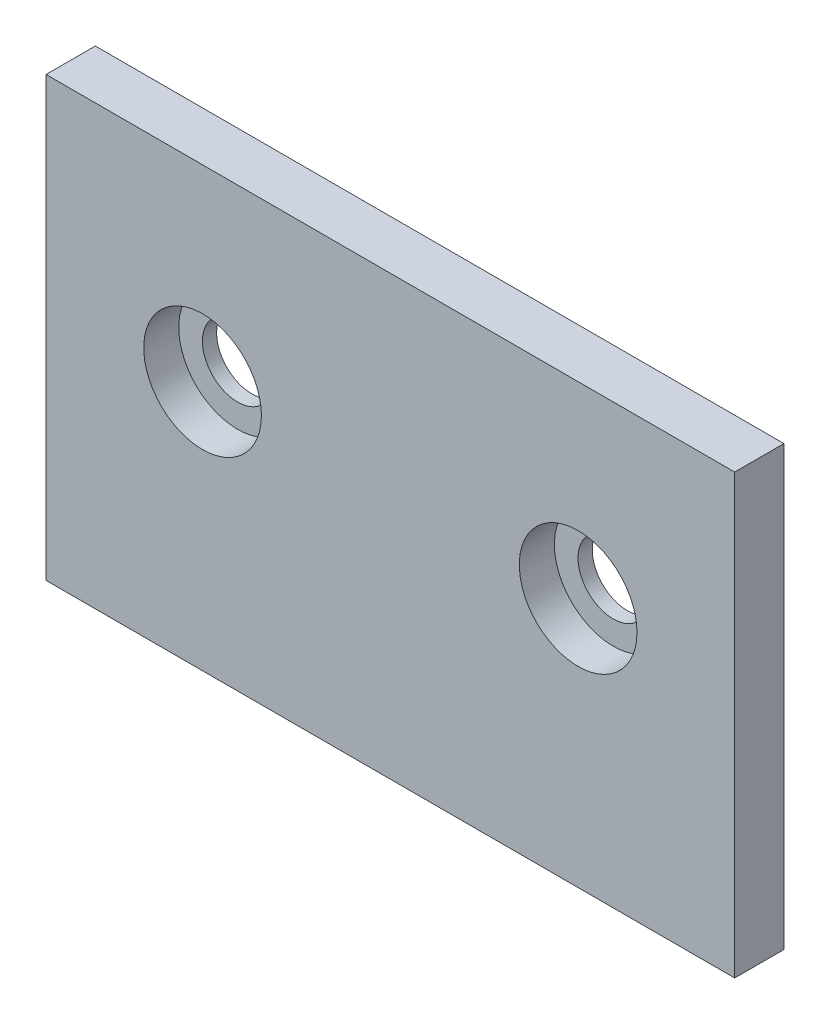
ISO-10303-21;
HEADER;
FILE_DESCRIPTION(('STEP AP214'),'2;1');
FILE_NAME('part.step','',(''),(''),'','','');
FILE_SCHEMA(('AUTOMOTIVE_DESIGN { 1 0 10303 214 1 1 1 1 }'));
ENDSEC;
DATA;
#1=APPLICATION_CONTEXT('core data for automotive mechanical design processes');
#2=APPLICATION_PROTOCOL_DEFINITION('international standard','automotive_design',2000,#1);
#3=PRODUCT_CONTEXT('',#1,'mechanical');
#4=PRODUCT('Part','Part','',(#3));
#5=PRODUCT_RELATED_PRODUCT_CATEGORY('part','',(#4));
#6=PRODUCT_DEFINITION_FORMATION('','',#4);
#7=PRODUCT_DEFINITION_CONTEXT('part definition',#1,'design');
#8=PRODUCT_DEFINITION('design','',#6,#7);
#9=PRODUCT_DEFINITION_SHAPE('','',#8);
#10=(LENGTH_UNIT() NAMED_UNIT(*) SI_UNIT(.MILLI.,.METRE.));
#11=(NAMED_UNIT(*) PLANE_ANGLE_UNIT() SI_UNIT($,.RADIAN.));
#12=(NAMED_UNIT(*) SI_UNIT($,.STERADIAN.) SOLID_ANGLE_UNIT());
#13=UNCERTAINTY_MEASURE_WITH_UNIT(LENGTH_MEASURE(1.E-05),#10,'distance_accuracy_value','');
#14=(GEOMETRIC_REPRESENTATION_CONTEXT(3) GLOBAL_UNCERTAINTY_ASSIGNED_CONTEXT((#13)) GLOBAL_UNIT_ASSIGNED_CONTEXT((#10,
#11,#12)) REPRESENTATION_CONTEXT('',''));
#15=CARTESIAN_POINT('',(0.,0.,0.));
#16=DIRECTION('',(0.,0.,1.));
#17=DIRECTION('',(1.,0.,0.));
#18=AXIS2_PLACEMENT_3D('',#15,#16,#17);
#19=CARTESIAN_POINT('',(34.925,22.225,-5.));
#20=DIRECTION('',(1.,0.,0.));
#21=DIRECTION('',(0.,0.,-1.));
#22=AXIS2_PLACEMENT_3D('',#19,#20,#21);
#23=PLANE('',#22);
#24=DIRECTION('',(0.,1.,0.));
#25=VECTOR('',#24,1.);
#26=CARTESIAN_POINT('',(34.925,22.225,0.));
#27=LINE('',#26,#25);
#28=CARTESIAN_POINT('',(34.925,-22.225,0.));
#29=VERTEX_POINT('',#28);
#30=CARTESIAN_POINT('',(34.925,22.225,0.));
#31=VERTEX_POINT('',#30);
#32=EDGE_CURVE('E100',#29,#31,#27,.T.);
#33=ORIENTED_EDGE('',*,*,#32,.F.);
#34=DIRECTION('',(0.,0.,1.));
#35=VECTOR('',#34,1.);
#36=CARTESIAN_POINT('',(34.925,-22.225,-5.));
#37=LINE('',#36,#35);
#38=CARTESIAN_POINT('',(34.925,-22.225,-5.));
#39=VERTEX_POINT('',#38);
#40=EDGE_CURVE('E11',#39,#29,#37,.T.);
#41=ORIENTED_EDGE('',*,*,#40,.F.);
#42=DIRECTION('',(0.,1.,0.));
#43=VECTOR('',#42,1.);
#44=CARTESIAN_POINT('',(34.925,22.225,-5.));
#45=LINE('',#44,#43);
#46=CARTESIAN_POINT('',(34.925,22.225,-5.));
#47=VERTEX_POINT('',#46);
#48=EDGE_CURVE('E93',#39,#47,#45,.T.);
#49=ORIENTED_EDGE('',*,*,#48,.T.);
#50=DIRECTION('',(0.,0.,1.));
#51=VECTOR('',#50,1.);
#52=CARTESIAN_POINT('',(34.925,22.225,-5.));
#53=LINE('',#52,#51);
#54=EDGE_CURVE('E76',#47,#31,#53,.T.);
#55=ORIENTED_EDGE('',*,*,#54,.T.);
#56=EDGE_LOOP('',(#33,#41,#49,#55));
#57=FACE_BOUND('',#56,.T.);
#58=ADVANCED_FACE('F33',(#57),#23,.T.);
#59=CARTESIAN_POINT('',(-34.925,-22.225,-5.));
#60=DIRECTION('',(0.,-1.,0.));
#61=DIRECTION('',(0.,0.,-1.));
#62=AXIS2_PLACEMENT_3D('',#59,#60,#61);
#63=PLANE('',#62);
#64=DIRECTION('',(1.,0.,0.));
#65=VECTOR('',#64,1.);
#66=CARTESIAN_POINT('',(-34.925,-22.225,0.));
#67=LINE('',#66,#65);
#68=CARTESIAN_POINT('',(-34.925,-22.225,0.));
#69=VERTEX_POINT('',#68);
#70=EDGE_CURVE('E95',#69,#29,#67,.T.);
#71=ORIENTED_EDGE('',*,*,#70,.F.);
#72=DIRECTION('',(0.,0.,1.));
#73=VECTOR('',#72,1.);
#74=CARTESIAN_POINT('',(-34.925,-22.225,-5.));
#75=LINE('',#74,#73);
#76=CARTESIAN_POINT('',(-34.925,-22.225,-5.));
#77=VERTEX_POINT('',#76);
#78=EDGE_CURVE('E42',#77,#69,#75,.T.);
#79=ORIENTED_EDGE('',*,*,#78,.F.);
#80=DIRECTION('',(1.,0.,0.));
#81=VECTOR('',#80,1.);
#82=CARTESIAN_POINT('',(-34.925,-22.225,-5.));
#83=LINE('',#82,#81);
#84=EDGE_CURVE('E90',#77,#39,#83,.T.);
#85=ORIENTED_EDGE('',*,*,#84,.T.);
#86=ORIENTED_EDGE('',*,*,#40,.T.);
#87=EDGE_LOOP('',(#71,#79,#85,#86));
#88=FACE_BOUND('',#87,.T.);
#89=ADVANCED_FACE('F143',(#88),#63,.T.);
#90=CARTESIAN_POINT('',(-34.925,22.225,-5.));
#91=DIRECTION('',(-1.,0.,0.));
#92=DIRECTION('',(0.,-1.,0.));
#93=AXIS2_PLACEMENT_3D('',#90,#91,#92);
#94=PLANE('',#93);
#95=DIRECTION('',(0.,-1.,0.));
#96=VECTOR('',#95,1.);
#97=CARTESIAN_POINT('',(-34.925,22.225,0.));
#98=LINE('',#97,#96);
#99=CARTESIAN_POINT('',(-34.925,22.225,0.));
#100=VERTEX_POINT('',#99);
#101=EDGE_CURVE('E84',#100,#69,#98,.T.);
#102=ORIENTED_EDGE('',*,*,#101,.F.);
#103=DIRECTION('',(0.,0.,1.));
#104=VECTOR('',#103,1.);
#105=CARTESIAN_POINT('',(-34.925,22.225,-5.));
#106=LINE('',#105,#104);
#107=CARTESIAN_POINT('',(-34.925,22.225,-5.));
#108=VERTEX_POINT('',#107);
#109=EDGE_CURVE('E79',#108,#100,#106,.T.);
#110=ORIENTED_EDGE('',*,*,#109,.F.);
#111=DIRECTION('',(0.,-1.,0.));
#112=VECTOR('',#111,1.);
#113=CARTESIAN_POINT('',(-34.925,22.225,-5.));
#114=LINE('',#113,#112);
#115=EDGE_CURVE('E82',#108,#77,#114,.T.);
#116=ORIENTED_EDGE('',*,*,#115,.T.);
#117=ORIENTED_EDGE('',*,*,#78,.T.);
#118=EDGE_LOOP('',(#102,#110,#116,#117));
#119=FACE_BOUND('',#118,.T.);
#120=ADVANCED_FACE('F81',(#119),#94,.T.);
#121=CARTESIAN_POINT('',(-34.925,22.225,-5.));
#122=DIRECTION('',(0.,1.,0.));
#123=DIRECTION('',(0.,0.,1.));
#124=AXIS2_PLACEMENT_3D('',#121,#122,#123);
#125=PLANE('',#124);
#126=DIRECTION('',(-1.,0.,0.));
#127=VECTOR('',#126,1.);
#128=CARTESIAN_POINT('',(-34.925,22.225,0.));
#129=LINE('',#128,#127);
#130=EDGE_CURVE('E103',#31,#100,#129,.T.);
#131=ORIENTED_EDGE('',*,*,#130,.F.);
#132=ORIENTED_EDGE('',*,*,#54,.F.);
#133=DIRECTION('',(-1.,0.,0.));
#134=VECTOR('',#133,1.);
#135=CARTESIAN_POINT('',(-34.925,22.225,-5.));
#136=LINE('',#135,#134);
#137=EDGE_CURVE('E89',#47,#108,#136,.T.);
#138=ORIENTED_EDGE('',*,*,#137,.T.);
#139=ORIENTED_EDGE('',*,*,#109,.T.);
#140=EDGE_LOOP('',(#131,#132,#138,#139));
#141=FACE_BOUND('',#140,.T.);
#142=ADVANCED_FACE('F92',(#141),#125,.T.);
#143=CARTESIAN_POINT('',(0.,0.,-5.));
#144=DIRECTION('',(0.,0.,1.));
#145=DIRECTION('',(1.,0.,0.));
#146=AXIS2_PLACEMENT_3D('',#143,#144,#145);
#147=PLANE('',#146);
#148=CARTESIAN_POINT('',(-19.05,3.17499999999999,-5.));
#149=DIRECTION('',(0.,0.,1.));
#150=DIRECTION('',(1.,0.,0.));
#151=AXIS2_PLACEMENT_3D('',#148,#149,#150);
#152=CIRCLE('',#151,3.57123999999999);
#153=CARTESIAN_POINT('',(-15.47876,3.17499999999999,-5.));
#154=VERTEX_POINT('',#153);
#155=EDGE_CURVE('E36',#154,#154,#152,.T.);
#156=ORIENTED_EDGE('',*,*,#155,.T.);
#157=EDGE_LOOP('',(#156));
#158=FACE_BOUND('',#157,.T.);
#159=CARTESIAN_POINT('',(19.05,3.175,-5.));
#160=DIRECTION('',(0.,0.,1.));
#161=DIRECTION('',(1.,0.,0.));
#162=AXIS2_PLACEMENT_3D('',#159,#160,#161);
#163=CIRCLE('',#162,3.57123999999999);
#164=CARTESIAN_POINT('',(22.62124,3.175,-5.));
#165=VERTEX_POINT('',#164);
#166=EDGE_CURVE('E104',#165,#165,#163,.T.);
#167=ORIENTED_EDGE('',*,*,#166,.T.);
#168=EDGE_LOOP('',(#167));
#169=FACE_BOUND('',#168,.T.);
#170=ORIENTED_EDGE('',*,*,#48,.F.);
#171=ORIENTED_EDGE('',*,*,#84,.F.);
#172=ORIENTED_EDGE('',*,*,#115,.F.);
#173=ORIENTED_EDGE('',*,*,#137,.F.);
#174=EDGE_LOOP('',(#170,#171,#172,#173));
#175=FACE_BOUND('',#174,.T.);
#176=ADVANCED_FACE('F88',(#158,#169,#175),#147,.F.);
#177=CARTESIAN_POINT('',(0.,0.,0.));
#178=DIRECTION('',(0.,0.,1.));
#179=DIRECTION('',(1.,0.,0.));
#180=AXIS2_PLACEMENT_3D('',#177,#178,#179);
#181=PLANE('',#180);
#182=CARTESIAN_POINT('',(-19.05,3.17499999999999,0.));
#183=DIRECTION('',(0.,0.,1.));
#184=DIRECTION('',(1.,0.,0.));
#185=AXIS2_PLACEMENT_3D('',#182,#183,#184);
#186=CIRCLE('',#185,5.96899999999999);
#187=CARTESIAN_POINT('',(-13.081,3.17499999999999,0.));
#188=VERTEX_POINT('',#187);
#189=EDGE_CURVE('E130',#188,#188,#186,.T.);
#190=ORIENTED_EDGE('',*,*,#189,.F.);
#191=EDGE_LOOP('',(#190));
#192=FACE_BOUND('',#191,.T.);
#193=CARTESIAN_POINT('',(19.05,3.175,0.));
#194=DIRECTION('',(0.,0.,1.));
#195=DIRECTION('',(1.,0.,0.));
#196=AXIS2_PLACEMENT_3D('',#193,#194,#195);
#197=CIRCLE('',#196,5.96899999999999);
#198=CARTESIAN_POINT('',(25.019,3.175,0.));
#199=VERTEX_POINT('',#198);
#200=EDGE_CURVE('E119',#199,#199,#197,.T.);
#201=ORIENTED_EDGE('',*,*,#200,.F.);
#202=EDGE_LOOP('',(#201));
#203=FACE_BOUND('',#202,.T.);
#204=ORIENTED_EDGE('',*,*,#32,.T.);
#205=ORIENTED_EDGE('',*,*,#130,.T.);
#206=ORIENTED_EDGE('',*,*,#101,.T.);
#207=ORIENTED_EDGE('',*,*,#70,.T.);
#208=EDGE_LOOP('',(#204,#205,#206,#207));
#209=FACE_BOUND('',#208,.T.);
#210=ADVANCED_FACE('F136',(#192,#203,#209),#181,.T.);
#211=CARTESIAN_POINT('',(19.05,3.175,0.));
#212=DIRECTION('',(0.,0.,1.));
#213=DIRECTION('',(1.,0.,0.));
#214=AXIS2_PLACEMENT_3D('',#211,#212,#213);
#215=CYLINDRICAL_SURFACE('',#214,3.57123999999999);
#216=CARTESIAN_POINT('',(19.05,3.175,-3.556));
#217=DIRECTION('',(0.,0.,1.));
#218=DIRECTION('',(1.,0.,0.));
#219=AXIS2_PLACEMENT_3D('',#216,#217,#218);
#220=CIRCLE('',#219,3.57124);
#221=CARTESIAN_POINT('',(22.62124,3.175,-3.556));
#222=VERTEX_POINT('',#221);
#223=EDGE_CURVE('E111',#222,#222,#220,.T.);
#224=ORIENTED_EDGE('',*,*,#223,.T.);
#225=EDGE_LOOP('',(#224));
#226=FACE_BOUND('',#225,.T.);
#227=ORIENTED_EDGE('',*,*,#166,.F.);
#228=EDGE_LOOP('',(#227));
#229=FACE_BOUND('',#228,.T.);
#230=ADVANCED_FACE('F139',(#226,#229),#215,.F.);
#231=CARTESIAN_POINT('',(22.62124,3.175,-3.556));
#232=DIRECTION('',(0.,0.,-1.));
#233=DIRECTION('',(-1.,0.,0.));
#234=AXIS2_PLACEMENT_3D('',#231,#232,#233);
#235=PLANE('',#234);
#236=ORIENTED_EDGE('',*,*,#223,.F.);
#237=EDGE_LOOP('',(#236));
#238=FACE_BOUND('',#237,.T.);
#239=CARTESIAN_POINT('',(19.05,3.175,-3.556));
#240=DIRECTION('',(0.,0.,1.));
#241=DIRECTION('',(1.,0.,0.));
#242=AXIS2_PLACEMENT_3D('',#239,#240,#241);
#243=CIRCLE('',#242,5.96899999999999);
#244=CARTESIAN_POINT('',(25.019,3.175,-3.556));
#245=VERTEX_POINT('',#244);
#246=EDGE_CURVE('E115',#245,#245,#243,.T.);
#247=ORIENTED_EDGE('',*,*,#246,.T.);
#248=EDGE_LOOP('',(#247));
#249=FACE_BOUND('',#248,.T.);
#250=ADVANCED_FACE('F163',(#238,#249),#235,.F.);
#251=CARTESIAN_POINT('',(19.05,3.175,0.));
#252=DIRECTION('',(0.,0.,1.));
#253=DIRECTION('',(1.,0.,0.));
#254=AXIS2_PLACEMENT_3D('',#251,#252,#253);
#255=CYLINDRICAL_SURFACE('',#254,5.96899999999999);
#256=ORIENTED_EDGE('',*,*,#246,.F.);
#257=EDGE_LOOP('',(#256));
#258=FACE_BOUND('',#257,.T.);
#259=ORIENTED_EDGE('',*,*,#200,.T.);
#260=EDGE_LOOP('',(#259));
#261=FACE_BOUND('',#260,.T.);
#262=ADVANCED_FACE('F166',(#258,#261),#255,.F.);
#263=CARTESIAN_POINT('',(-19.05,3.17499999999999,0.));
#264=DIRECTION('',(0.,0.,1.));
#265=DIRECTION('',(1.,0.,0.));
#266=AXIS2_PLACEMENT_3D('',#263,#264,#265);
#267=CYLINDRICAL_SURFACE('',#266,3.57123999999999);
#268=CARTESIAN_POINT('',(-19.05,3.17499999999999,-3.556));
#269=DIRECTION('',(0.,0.,1.));
#270=DIRECTION('',(1.,0.,0.));
#271=AXIS2_PLACEMENT_3D('',#268,#269,#270);
#272=CIRCLE('',#271,3.57124);
#273=CARTESIAN_POINT('',(-15.47876,3.17499999999999,-3.556));
#274=VERTEX_POINT('',#273);
#275=EDGE_CURVE('E124',#274,#274,#272,.T.);
#276=ORIENTED_EDGE('',*,*,#275,.T.);
#277=EDGE_LOOP('',(#276));
#278=FACE_BOUND('',#277,.T.);
#279=ORIENTED_EDGE('',*,*,#155,.F.);
#280=EDGE_LOOP('',(#279));
#281=FACE_BOUND('',#280,.T.);
#282=ADVANCED_FACE('F170',(#278,#281),#267,.F.);
#283=CARTESIAN_POINT('',(-15.47876,3.17499999999999,-3.556));
#284=DIRECTION('',(0.,0.,-1.));
#285=DIRECTION('',(-1.,0.,0.));
#286=AXIS2_PLACEMENT_3D('',#283,#284,#285);
#287=PLANE('',#286);
#288=ORIENTED_EDGE('',*,*,#275,.F.);
#289=EDGE_LOOP('',(#288));
#290=FACE_BOUND('',#289,.T.);
#291=CARTESIAN_POINT('',(-19.05,3.17499999999999,-3.556));
#292=DIRECTION('',(0.,0.,1.));
#293=DIRECTION('',(1.,0.,0.));
#294=AXIS2_PLACEMENT_3D('',#291,#292,#293);
#295=CIRCLE('',#294,5.96899999999999);
#296=CARTESIAN_POINT('',(-13.081,3.17499999999999,-3.556));
#297=VERTEX_POINT('',#296);
#298=EDGE_CURVE('E127',#297,#297,#295,.T.);
#299=ORIENTED_EDGE('',*,*,#298,.T.);
#300=EDGE_LOOP('',(#299));
#301=FACE_BOUND('',#300,.T.);
#302=ADVANCED_FACE('F174',(#290,#301),#287,.F.);
#303=CARTESIAN_POINT('',(-19.05,3.17499999999999,0.));
#304=DIRECTION('',(0.,0.,1.));
#305=DIRECTION('',(1.,0.,0.));
#306=AXIS2_PLACEMENT_3D('',#303,#304,#305);
#307=CYLINDRICAL_SURFACE('',#306,5.96899999999999);
#308=ORIENTED_EDGE('',*,*,#298,.F.);
#309=EDGE_LOOP('',(#308));
#310=FACE_BOUND('',#309,.T.);
#311=ORIENTED_EDGE('',*,*,#189,.T.);
#312=EDGE_LOOP('',(#311));
#313=FACE_BOUND('',#312,.T.);
#314=ADVANCED_FACE('F134',(#310,#313),#307,.F.);
#315=CLOSED_SHELL('',(#58,#89,#120,#142,#176,#210,#230,#250,#262,#282,#302,#314));
#316=MANIFOLD_SOLID_BREP('B2',#315);
#317=ADVANCED_BREP_SHAPE_REPRESENTATION('',(#18,#316),#14);
#318=SHAPE_DEFINITION_REPRESENTATION(#9,#317);
ENDSEC;
END-ISO-10303-21;
